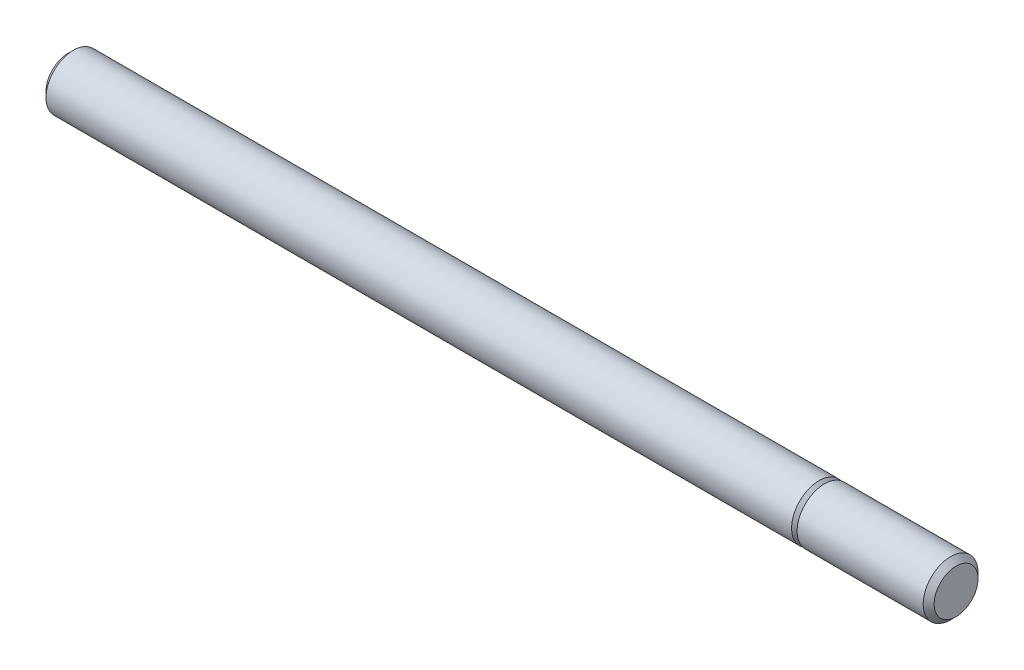
ISO-10303-21;
HEADER;
FILE_DESCRIPTION(('STEP AP214'),'2;1');
FILE_NAME('part.step','',(''),(''),'','','');
FILE_SCHEMA(('AUTOMOTIVE_DESIGN { 1 0 10303 214 1 1 1 1 }'));
ENDSEC;
DATA;
#1=APPLICATION_CONTEXT('core data for automotive mechanical design processes');
#2=APPLICATION_PROTOCOL_DEFINITION('international standard','automotive_design',2000,#1);
#3=PRODUCT_CONTEXT('',#1,'mechanical');
#4=PRODUCT('Part','Part','',(#3));
#5=PRODUCT_RELATED_PRODUCT_CATEGORY('part','',(#4));
#6=PRODUCT_DEFINITION_FORMATION('','',#4);
#7=PRODUCT_DEFINITION_CONTEXT('part definition',#1,'design');
#8=PRODUCT_DEFINITION('design','',#6,#7);
#9=PRODUCT_DEFINITION_SHAPE('','',#8);
#10=(LENGTH_UNIT() NAMED_UNIT(*) SI_UNIT(.MILLI.,.METRE.));
#11=(NAMED_UNIT(*) PLANE_ANGLE_UNIT() SI_UNIT($,.RADIAN.));
#12=(NAMED_UNIT(*) SI_UNIT($,.STERADIAN.) SOLID_ANGLE_UNIT());
#13=UNCERTAINTY_MEASURE_WITH_UNIT(LENGTH_MEASURE(1.E-05),#10,'distance_accuracy_value','');
#14=(GEOMETRIC_REPRESENTATION_CONTEXT(3) GLOBAL_UNCERTAINTY_ASSIGNED_CONTEXT((#13)) GLOBAL_UNIT_ASSIGNED_CONTEXT((#10,
#11,#12)) REPRESENTATION_CONTEXT('',''));
#15=CARTESIAN_POINT('',(0.,0.,0.));
#16=DIRECTION('',(0.,0.,1.));
#17=DIRECTION('',(1.,0.,0.));
#18=AXIS2_PLACEMENT_3D('',#15,#16,#17);
#19=CARTESIAN_POINT('',(69.,0.,0.));
#20=DIRECTION('',(1.,0.,0.));
#21=DIRECTION('',(0.,1.,0.));
#22=AXIS2_PLACEMENT_3D('',#19,#20,#21);
#23=PLANE('',#22);
#24=CARTESIAN_POINT('',(69.,0.,0.));
#25=DIRECTION('',(-1.,0.,0.));
#26=DIRECTION('',(0.,0.,-1.));
#27=AXIS2_PLACEMENT_3D('',#24,#25,#26);
#28=CIRCLE('',#27,1.99999999996952);
#29=CARTESIAN_POINT('',(69.,0.,-1.99999999996952));
#30=VERTEX_POINT('',#29);
#31=EDGE_CURVE('E75',#30,#30,#28,.T.);
#32=ORIENTED_EDGE('',*,*,#31,.F.);
#33=EDGE_LOOP('',(#32));
#34=FACE_BOUND('',#33,.T.);
#35=CARTESIAN_POINT('',(69.,0.,0.));
#36=DIRECTION('',(1.,0.,0.));
#37=DIRECTION('',(0.,0.,-1.));
#38=AXIS2_PLACEMENT_3D('',#35,#36,#37);
#39=CIRCLE('',#38,2.5);
#40=CARTESIAN_POINT('',(69.,0.,-2.5));
#41=VERTEX_POINT('',#40);
#42=EDGE_CURVE('E90',#41,#41,#39,.T.);
#43=ORIENTED_EDGE('',*,*,#42,.F.);
#44=EDGE_LOOP('',(#43));
#45=FACE_BOUND('',#44,.T.);
#46=ADVANCED_FACE('F15',(#34,#45),#23,.F.);
#47=CARTESIAN_POINT('',(81.,0.,0.));
#48=DIRECTION('',(1.,0.,0.));
#49=DIRECTION('',(0.,1.,0.));
#50=AXIS2_PLACEMENT_3D('',#47,#48,#49);
#51=PLANE('',#50);
#52=CARTESIAN_POINT('',(81.,0.,0.));
#53=DIRECTION('',(1.,0.,0.));
#54=DIRECTION('',(0.,0.,-1.));
#55=AXIS2_PLACEMENT_3D('',#52,#53,#54);
#56=CIRCLE('',#55,2.);
#57=CARTESIAN_POINT('',(81.,0.,-2.));
#58=VERTEX_POINT('',#57);
#59=EDGE_CURVE('E154',#58,#58,#56,.T.);
#60=ORIENTED_EDGE('',*,*,#59,.T.);
#61=EDGE_LOOP('',(#60));
#62=FACE_BOUND('',#61,.T.);
#63=ADVANCED_FACE('F123',(#62),#51,.T.);
#64=CARTESIAN_POINT('',(-0.12,-1.5,-2.));
#65=DIRECTION('',(0.,0.,1.));
#66=DIRECTION('',(1.,0.,0.));
#67=AXIS2_PLACEMENT_3D('',#64,#65,#66);
#68=PLANE('',#67);
#69=DIRECTION('',(1.,0.,0.));
#70=VECTOR('',#69,1.);
#71=CARTESIAN_POINT('',(68.5,-1.49999999903832,-2.00000000072127));
#72=LINE('',#71,#70);
#73=CARTESIAN_POINT('',(0.499999999995227,-1.49999999951916,-2.00000000036063));
#74=VERTEX_POINT('',#73);
#75=CARTESIAN_POINT('',(20.000000004,-1.49999999951916,-2.00000000036063));
#76=VERTEX_POINT('',#75);
#77=EDGE_CURVE('E10',#74,#76,#72,.T.);
#78=ORIENTED_EDGE('',*,*,#77,.F.);
#79=CARTESIAN_POINT('',(5.2192237308279E-11,-5.61218983251785E-12,-1.99999999998818));
#80=CARTESIAN_POINT('',(-5.14929595338323E-05,-0.0614966481156282,-1.99999999999576));
#81=CARTESIAN_POINT('',(0.00283521188336272,-0.122961796137201,-1.99999999999887));
#82=CARTESIAN_POINT('',(0.0140787611431285,-0.245274670087983,-2.00000000000113));
#83=CARTESIAN_POINT('',(0.0224249778979819,-0.30612336281255,-2.0000000000003));
#84=CARTESIAN_POINT('',(0.0440030183911678,-0.425885509956287,-1.9999999999997));
#85=CARTESIAN_POINT('',(0.0571511751572047,-0.484814317327879,-1.99999999999992));
#86=CARTESIAN_POINT('',(0.0877492381871042,-0.601555526142409,-2.00000000000008));
#87=CARTESIAN_POINT('',(0.105200918733286,-0.65936745648476,-2.00000000000002));
#88=CARTESIAN_POINT('',(0.147429794250611,-0.784576263432931,-1.99999999999997));
#89=CARTESIAN_POINT('',(0.172968418423396,-0.851714510682012,-1.99999999999999));
#90=CARTESIAN_POINT('',(0.228254794368707,-0.984250024345971,-2.00000000000001));
#91=CARTESIAN_POINT('',(0.258004595064751,-1.04964642476299,-2.));
#92=CARTESIAN_POINT('',(0.321521497107475,-1.18016546496916,-2.));
#93=CARTESIAN_POINT('',(0.35536056992401,-1.24525271492554,-2.));
#94=CARTESIAN_POINT('',(0.42578390815372,-1.37378196939097,-2.));
#95=CARTESIAN_POINT('',(0.462363251189991,-1.43722666100298,-2.));
#96=CARTESIAN_POINT('',(0.499999999505303,-1.49999999919142,-2.));
#97=B_SPLINE_CURVE_WITH_KNOTS('',3,(#79,#80,#81,#82,#83,#84,#85,#86,#87,#88,#89,#90,#91,#92,#93,
#94,#95,#96),.UNSPECIFIED.,.F.,.F.,(4,2,2,2,2,2,2,2,4),(0.,0.184371949259741,0.368386057944626,
0.549336051720812,0.730360773730427,0.945674044691921,1.16109243747302,1.3810914235689,
1.60070428542609),.UNSPECIFIED.);
#98=CARTESIAN_POINT('',(2.3647891159409E-11,-5.61218983253159E-12,-1.99999999997635));
#99=VERTEX_POINT('',#98);
#100=EDGE_CURVE('E32',#99,#74,#97,.T.);
#101=ORIENTED_EDGE('',*,*,#100,.F.);
#102=CARTESIAN_POINT('',(0.499999999667973,1.49999999946254,-2.));
#103=CARTESIAN_POINT('',(0.456626301657228,1.42763018605802,-2.));
#104=CARTESIAN_POINT('',(0.414631297748689,1.35436226479174,-2.));
#105=CARTESIAN_POINT('',(0.334355641419526,1.20549660576384,-2.));
#106=CARTESIAN_POINT('',(0.296088580051025,1.12989157658612,-2.));
#107=CARTESIAN_POINT('',(0.225465808053507,0.978296734360589,-2.));
#108=CARTESIAN_POINT('',(0.192983460760234,0.902366735755508,-2.));
#109=CARTESIAN_POINT('',(0.134190983156607,0.748220644400903,-2.));
#110=CARTESIAN_POINT('',(0.107872337387169,0.670007875548921,-2.));
#111=CARTESIAN_POINT('',(0.0719138966535704,0.543060599562929,-2.));
#112=CARTESIAN_POINT('',(0.0598098971412225,0.495021163085394,-2.));
#113=CARTESIAN_POINT('',(0.038720569349037,0.398260418877098,-2.));
#114=CARTESIAN_POINT('',(0.0297348482446885,0.349539197839068,-2.));
#115=CARTESIAN_POINT('',(0.0150728759952774,0.250852177183155,-2.));
#116=CARTESIAN_POINT('',(0.00944799820838882,0.200878653862139,-2.));
#117=CARTESIAN_POINT('',(0.00189765157583972,0.10060761918529,-2.));
#118=CARTESIAN_POINT('',(-2.43313973331228E-05,0.0503098472229434,-2.));
#119=CARTESIAN_POINT('',(4.7295701633951E-11,-4.2252594727054E-12,-2.));
#120=B_SPLINE_CURVE_WITH_KNOTS('',3,(#102,#103,#104,#105,#106,#107,#108,#109,#110,#111,#112,
#113,#114,#115,#116,#117,#118,#119),.UNSPECIFIED.,.F.,.F.,(4,2,2,2,2,2,2,2,4),(0.,
0.253195034660983,0.507281075905324,0.754837752511517,1.002050372691,1.15058504552425,
1.29910099993287,1.44983263750253,1.60070610330279),.UNSPECIFIED.);
#121=CARTESIAN_POINT('',(0.499999999833987,1.49999999962952,-2.));
#122=VERTEX_POINT('',#121);
#123=EDGE_CURVE('E20',#122,#99,#120,.T.);
#124=ORIENTED_EDGE('',*,*,#123,.F.);
#125=DIRECTION('',(-1.,0.,0.));
#126=VECTOR('',#125,1.);
#127=CARTESIAN_POINT('',(-0.12,1.49999999979651,-2.));
#128=LINE('',#127,#126);
#129=CARTESIAN_POINT('',(20.000000006,1.49999999989825,-2.));
#130=VERTEX_POINT('',#129);
#131=EDGE_CURVE('E77',#130,#122,#128,.T.);
#132=ORIENTED_EDGE('',*,*,#131,.F.);
#133=DIRECTION('',(0.,1.,0.));
#134=VECTOR('',#133,1.);
#135=CARTESIAN_POINT('',(20.000000004,-1.5,-2.));
#136=LINE('',#135,#134);
#137=EDGE_CURVE('E70',#76,#130,#136,.T.);
#138=ORIENTED_EDGE('',*,*,#137,.F.);
#139=EDGE_LOOP('',(#78,#101,#124,#132,#138));
#140=FACE_BOUND('',#139,.T.);
#141=ADVANCED_FACE('F17',(#140),#68,.F.);
#142=CARTESIAN_POINT('',(20.,-1.518,-2.503));
#143=DIRECTION('',(-1.,0.,0.));
#144=DIRECTION('',(0.,0.,1.));
#145=AXIS2_PLACEMENT_3D('',#142,#143,#144);
#146=PLANE('',#145);
#147=CARTESIAN_POINT('',(20.000000008,0.,0.));
#148=DIRECTION('',(1.,0.,0.));
#149=DIRECTION('',(0.,0.,1.));
#150=AXIS2_PLACEMENT_3D('',#147,#148,#149);
#151=CIRCLE('',#150,2.5);
#152=EDGE_CURVE('E73',#76,#130,#151,.T.);
#153=ORIENTED_EDGE('',*,*,#152,.F.);
#154=ORIENTED_EDGE('',*,*,#137,.T.);
#155=EDGE_LOOP('',(#153,#154));
#156=FACE_BOUND('',#155,.T.);
#157=ADVANCED_FACE('F71',(#156),#146,.T.);
#158=CARTESIAN_POINT('',(0.,-2.024,2.024));
#159=DIRECTION('',(1.,0.,0.));
#160=DIRECTION('',(0.,1.,0.));
#161=AXIS2_PLACEMENT_3D('',#158,#159,#160);
#162=PLANE('',#161);
#163=CARTESIAN_POINT('',(0.,0.,0.));
#164=DIRECTION('',(1.,0.,0.));
#165=DIRECTION('',(0.,0.,-1.));
#166=AXIS2_PLACEMENT_3D('',#163,#164,#165);
#167=CIRCLE('',#166,1.9999999999527);
#168=EDGE_CURVE('E97',#99,#99,#167,.T.);
#169=ORIENTED_EDGE('',*,*,#168,.F.);
#170=EDGE_LOOP('',(#169));
#171=FACE_BOUND('',#170,.T.);
#172=ADVANCED_FACE('F114',(#171),#162,.F.);
#173=CARTESIAN_POINT('',(68.499999999915,0.,0.));
#174=DIRECTION('',(-1.,0.,0.));
#175=DIRECTION('',(0.,0.,1.));
#176=AXIS2_PLACEMENT_3D('',#173,#174,#175);
#177=CONICAL_SURFACE('',#176,2.50000000005457,0.785398163397448);
#178=CARTESIAN_POINT('',(68.5,0.,0.));
#179=DIRECTION('',(-1.,0.,0.));
#180=DIRECTION('',(0.,0.,1.));
#181=AXIS2_PLACEMENT_3D('',#178,#179,#180);
#182=CIRCLE('',#181,2.5);
#183=CARTESIAN_POINT('',(68.5,0.,2.5));
#184=VERTEX_POINT('',#183);
#185=EDGE_CURVE('E83',#184,#184,#182,.T.);
#186=ORIENTED_EDGE('',*,*,#185,.F.);
#187=EDGE_LOOP('',(#186));
#188=FACE_BOUND('',#187,.T.);
#189=ORIENTED_EDGE('',*,*,#31,.T.);
#190=EDGE_LOOP('',(#189));
#191=FACE_BOUND('',#190,.T.);
#192=ADVANCED_FACE('F111',(#188,#191),#177,.T.);
#193=CARTESIAN_POINT('',(0.499999999419742,0.,0.));
#194=DIRECTION('',(1.,0.,0.));
#195=DIRECTION('',(0.,0.,-1.));
#196=AXIS2_PLACEMENT_3D('',#193,#194,#195);
#197=CONICAL_SURFACE('',#196,2.49999999942929,0.785398163454292);
#198=ORIENTED_EDGE('',*,*,#168,.T.);
#199=ORIENTED_EDGE('',*,*,#100,.T.);
#200=CARTESIAN_POINT('',(0.5,0.,0.));
#201=DIRECTION('',(1.,0.,0.));
#202=DIRECTION('',(0.,0.,1.));
#203=AXIS2_PLACEMENT_3D('',#200,#201,#202);
#204=CIRCLE('',#203,2.5);
#205=EDGE_CURVE('E46',#122,#74,#204,.T.);
#206=ORIENTED_EDGE('',*,*,#205,.F.);
#207=ORIENTED_EDGE('',*,*,#123,.T.);
#208=EDGE_LOOP('',(#198,#199,#206,#207));
#209=FACE_BOUND('',#208,.T.);
#210=ADVANCED_FACE('F106',(#209),#197,.T.);
#211=CARTESIAN_POINT('',(68.5,0.,0.));
#212=DIRECTION('',(-1.,0.,0.));
#213=DIRECTION('',(0.,0.,1.));
#214=AXIS2_PLACEMENT_3D('',#211,#212,#213);
#215=CYLINDRICAL_SURFACE('',#214,2.5);
#216=ORIENTED_EDGE('',*,*,#77,.T.);
#217=ORIENTED_EDGE('',*,*,#152,.T.);
#218=ORIENTED_EDGE('',*,*,#131,.T.);
#219=ORIENTED_EDGE('',*,*,#205,.T.);
#220=EDGE_LOOP('',(#216,#217,#218,#219));
#221=FACE_BOUND('',#220,.T.);
#222=ORIENTED_EDGE('',*,*,#185,.T.);
#223=EDGE_LOOP('',(#222));
#224=FACE_BOUND('',#223,.T.);
#225=ADVANCED_FACE('F80',(#221,#224),#215,.T.);
#226=CARTESIAN_POINT('',(81.,0.,0.));
#227=DIRECTION('',(-1.,0.,0.));
#228=DIRECTION('',(0.,0.,1.));
#229=AXIS2_PLACEMENT_3D('',#226,#227,#228);
#230=CYLINDRICAL_SURFACE('',#229,2.5);
#231=ORIENTED_EDGE('',*,*,#42,.T.);
#232=EDGE_LOOP('',(#231));
#233=FACE_BOUND('',#232,.T.);
#234=CARTESIAN_POINT('',(80.5,0.,0.));
#235=DIRECTION('',(-1.,0.,0.));
#236=DIRECTION('',(0.,0.,-1.));
#237=AXIS2_PLACEMENT_3D('',#234,#235,#236);
#238=CIRCLE('',#237,2.5);
#239=CARTESIAN_POINT('',(80.5,0.,-2.5));
#240=VERTEX_POINT('',#239);
#241=EDGE_CURVE('E152',#240,#240,#238,.T.);
#242=ORIENTED_EDGE('',*,*,#241,.T.);
#243=EDGE_LOOP('',(#242));
#244=FACE_BOUND('',#243,.T.);
#245=ADVANCED_FACE('F135',(#233,#244),#230,.T.);
#246=CARTESIAN_POINT('',(81.,0.,0.));
#247=DIRECTION('',(-1.,0.,0.));
#248=DIRECTION('',(0.,0.,1.));
#249=AXIS2_PLACEMENT_3D('',#246,#247,#248);
#250=CONICAL_SURFACE('',#249,2.,0.785398163397446);
#251=ORIENTED_EDGE('',*,*,#241,.F.);
#252=EDGE_LOOP('',(#251));
#253=FACE_BOUND('',#252,.T.);
#254=ORIENTED_EDGE('',*,*,#59,.F.);
#255=EDGE_LOOP('',(#254));
#256=FACE_BOUND('',#255,.T.);
#257=ADVANCED_FACE('F141',(#253,#256),#250,.T.);
#258=CLOSED_SHELL('',(#46,#63,#141,#157,#172,#192,#210,#225,#245,#257));
#259=MANIFOLD_SOLID_BREP('B1',#258);
#260=ADVANCED_BREP_SHAPE_REPRESENTATION('',(#18,#259),#14);
#261=SHAPE_DEFINITION_REPRESENTATION(#9,#260);
ENDSEC;
END-ISO-10303-21;
